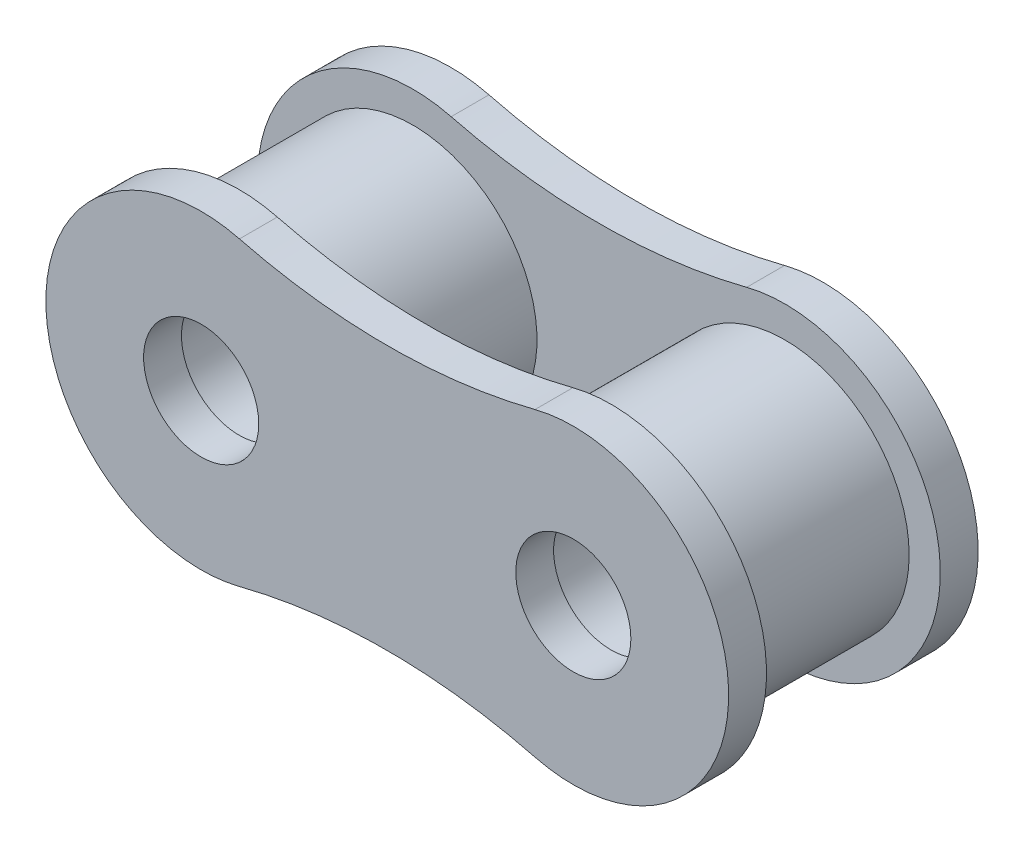
ISO-10303-21;
HEADER;
FILE_DESCRIPTION(('STEP AP214'),'2;1');
FILE_NAME('part.step','',(''),(''),'','','');
FILE_SCHEMA(('AUTOMOTIVE_DESIGN { 1 0 10303 214 1 1 1 1 }'));
ENDSEC;
DATA;
#1=APPLICATION_CONTEXT('core data for automotive mechanical design processes');
#2=APPLICATION_PROTOCOL_DEFINITION('international standard','automotive_design',2000,#1);
#3=PRODUCT_CONTEXT('',#1,'mechanical');
#4=PRODUCT('Part','Part','',(#3));
#5=PRODUCT_RELATED_PRODUCT_CATEGORY('part','',(#4));
#6=PRODUCT_DEFINITION_FORMATION('','',#4);
#7=PRODUCT_DEFINITION_CONTEXT('part definition',#1,'design');
#8=PRODUCT_DEFINITION('design','',#6,#7);
#9=PRODUCT_DEFINITION_SHAPE('','',#8);
#10=(LENGTH_UNIT() NAMED_UNIT(*) SI_UNIT(.MILLI.,.METRE.));
#11=(NAMED_UNIT(*) PLANE_ANGLE_UNIT() SI_UNIT($,.RADIAN.));
#12=(NAMED_UNIT(*) SI_UNIT($,.STERADIAN.) SOLID_ANGLE_UNIT());
#13=UNCERTAINTY_MEASURE_WITH_UNIT(LENGTH_MEASURE(1.E-05),#10,'distance_accuracy_value','');
#14=(GEOMETRIC_REPRESENTATION_CONTEXT(3) GLOBAL_UNCERTAINTY_ASSIGNED_CONTEXT((#13)) GLOBAL_UNIT_ASSIGNED_CONTEXT((#10,
#11,#12)) REPRESENTATION_CONTEXT('',''));
#15=CARTESIAN_POINT('',(0.,0.,0.));
#16=DIRECTION('',(0.,0.,1.));
#17=DIRECTION('',(1.,0.,0.));
#18=AXIS2_PLACEMENT_3D('',#15,#16,#17);
#19=CARTESIAN_POINT('',(-2.9972,0.,1.4));
#20=DIRECTION('',(0.,0.,-1.));
#21=DIRECTION('',(-1.,0.,0.));
#22=AXIS2_PLACEMENT_3D('',#19,#20,#21);
#23=CYLINDRICAL_SURFACE('',#22,2.);
#24=CARTESIAN_POINT('',(-2.9972,0.,1.4));
#25=DIRECTION('',(0.,0.,1.));
#26=DIRECTION('',(1.,0.,0.));
#27=AXIS2_PLACEMENT_3D('',#24,#25,#26);
#28=CIRCLE('',#27,2.);
#29=CARTESIAN_POINT('',(-0.9972,0.,1.4));
#30=VERTEX_POINT('',#29);
#31=EDGE_CURVE('E11',#30,#30,#28,.T.);
#32=ORIENTED_EDGE('',*,*,#31,.F.);
#33=EDGE_LOOP('',(#32));
#34=FACE_BOUND('',#33,.T.);
#35=CARTESIAN_POINT('',(-2.9972,0.,-1.4));
#36=DIRECTION('',(0.,0.,-1.));
#37=DIRECTION('',(-1.,0.,0.));
#38=AXIS2_PLACEMENT_3D('',#35,#36,#37);
#39=CIRCLE('',#38,2.);
#40=CARTESIAN_POINT('',(-4.9972,0.,-1.4));
#41=VERTEX_POINT('',#40);
#42=EDGE_CURVE('E166',#41,#41,#39,.T.);
#43=ORIENTED_EDGE('',*,*,#42,.F.);
#44=EDGE_LOOP('',(#43));
#45=FACE_BOUND('',#44,.T.);
#46=ADVANCED_FACE('F40',(#34,#45),#23,.T.);
#47=CARTESIAN_POINT('',(1.4986,5.89043594120135,1.4));
#48=DIRECTION('',(0.,0.,1.));
#49=DIRECTION('',(1.,0.,0.));
#50=AXIS2_PLACEMENT_3D('',#47,#48,#49);
#51=PLANE('',#50);
#52=CARTESIAN_POINT('',(-2.9972,0.,1.4));
#53=DIRECTION('',(0.,0.,1.));
#54=DIRECTION('',(1.,0.,0.));
#55=AXIS2_PLACEMENT_3D('',#52,#53,#54);
#56=CIRCLE('',#55,0.9271);
#57=CARTESIAN_POINT('',(-2.0701,0.,1.4));
#58=VERTEX_POINT('',#57);
#59=EDGE_CURVE('E180',#58,#58,#56,.T.);
#60=ORIENTED_EDGE('',*,*,#59,.T.);
#61=EDGE_LOOP('',(#60));
#62=FACE_BOUND('',#61,.T.);
#63=CARTESIAN_POINT('',(-2.9972,0.,1.4));
#64=DIRECTION('',(0.,0.,1.));
#65=DIRECTION('',(1.,0.,0.));
#66=AXIS2_PLACEMENT_3D('',#63,#64,#65);
#67=CIRCLE('',#66,0.9525);
#68=CARTESIAN_POINT('',(-2.0447,0.,1.4));
#69=VERTEX_POINT('',#68);
#70=EDGE_CURVE('E210',#69,#69,#67,.T.);
#71=ORIENTED_EDGE('',*,*,#70,.F.);
#72=EDGE_LOOP('',(#71));
#73=FACE_BOUND('',#72,.T.);
#74=ADVANCED_FACE('F229',(#62,#73),#51,.F.);
#75=CARTESIAN_POINT('',(1.4986,5.89043594120135,-1.4));
#76=DIRECTION('',(0.,0.,-1.));
#77=DIRECTION('',(1.,0.,0.));
#78=AXIS2_PLACEMENT_3D('',#75,#76,#77);
#79=PLANE('',#78);
#80=CARTESIAN_POINT('',(-2.9972,0.,-1.4));
#81=DIRECTION('',(0.,0.,1.));
#82=DIRECTION('',(1.,0.,0.));
#83=AXIS2_PLACEMENT_3D('',#80,#81,#82);
#84=CIRCLE('',#83,0.9271);
#85=CARTESIAN_POINT('',(-2.0701,0.,-1.4));
#86=VERTEX_POINT('',#85);
#87=EDGE_CURVE('E147',#86,#86,#84,.T.);
#88=ORIENTED_EDGE('',*,*,#87,.F.);
#89=EDGE_LOOP('',(#88));
#90=FACE_BOUND('',#89,.T.);
#91=CARTESIAN_POINT('',(-2.9972,0.,-1.4));
#92=DIRECTION('',(0.,0.,1.));
#93=DIRECTION('',(1.,0.,0.));
#94=AXIS2_PLACEMENT_3D('',#91,#92,#93);
#95=CIRCLE('',#94,0.9525);
#96=CARTESIAN_POINT('',(-2.0447,0.,-1.4));
#97=VERTEX_POINT('',#96);
#98=EDGE_CURVE('E48',#97,#97,#95,.T.);
#99=ORIENTED_EDGE('',*,*,#98,.T.);
#100=EDGE_LOOP('',(#99));
#101=FACE_BOUND('',#100,.T.);
#102=ADVANCED_FACE('F215',(#90,#101),#79,.F.);
#103=CARTESIAN_POINT('',(2.9972,0.,1.4));
#104=DIRECTION('',(0.,0.,1.));
#105=DIRECTION('',(1.,0.,0.));
#106=AXIS2_PLACEMENT_3D('',#103,#104,#105);
#107=CIRCLE('',#106,0.9271);
#108=CARTESIAN_POINT('',(3.9243,0.,1.4));
#109=VERTEX_POINT('',#108);
#110=EDGE_CURVE('E174',#109,#109,#107,.T.);
#111=ORIENTED_EDGE('',*,*,#110,.T.);
#112=EDGE_LOOP('',(#111));
#113=FACE_BOUND('',#112,.T.);
#114=CARTESIAN_POINT('',(2.9972,0.,1.4));
#115=DIRECTION('',(0.,0.,1.));
#116=DIRECTION('',(1.,0.,0.));
#117=AXIS2_PLACEMENT_3D('',#114,#115,#116);
#118=CIRCLE('',#117,0.9525);
#119=CARTESIAN_POINT('',(3.9497,0.,1.4));
#120=VERTEX_POINT('',#119);
#121=EDGE_CURVE('E163',#120,#120,#118,.T.);
#122=ORIENTED_EDGE('',*,*,#121,.F.);
#123=EDGE_LOOP('',(#122));
#124=FACE_BOUND('',#123,.T.);
#125=ADVANCED_FACE('F236',(#113,#124),#51,.F.);
#126=CARTESIAN_POINT('',(1.4986,5.89043594120135,2.0096));
#127=DIRECTION('',(0.,0.,1.));
#128=DIRECTION('',(1.,0.,0.));
#129=AXIS2_PLACEMENT_3D('',#126,#127,#128);
#130=PLANE('',#129);
#131=CARTESIAN_POINT('',(-2.9972,0.,2.0096));
#132=DIRECTION('',(0.,0.,1.));
#133=DIRECTION('',(1.,0.,0.));
#134=AXIS2_PLACEMENT_3D('',#131,#132,#133);
#135=CIRCLE('',#134,0.9271);
#136=CARTESIAN_POINT('',(-2.0701,0.,2.0096));
#137=VERTEX_POINT('',#136);
#138=EDGE_CURVE('E183',#137,#137,#135,.T.);
#139=ORIENTED_EDGE('',*,*,#138,.F.);
#140=EDGE_LOOP('',(#139));
#141=FACE_BOUND('',#140,.T.);
#142=CARTESIAN_POINT('',(0.,11.7808718824027,2.0096));
#143=DIRECTION('',(0.,0.,-1.));
#144=DIRECTION('',(1.,0.,0.));
#145=AXIS2_PLACEMENT_3D('',#142,#143,#144);
#146=CIRCLE('',#145,9.65425688240271);
#147=CARTESIAN_POINT('',(2.3803360723178,2.42466131752962,2.0096));
#148=VERTEX_POINT('',#147);
#149=CARTESIAN_POINT('',(-2.3803360723178,2.42466131752962,2.0096));
#150=VERTEX_POINT('',#149);
#151=EDGE_CURVE('E189',#148,#150,#146,.T.);
#152=ORIENTED_EDGE('',*,*,#151,.T.);
#153=CARTESIAN_POINT('',(-2.9972,0.,2.0096));
#154=DIRECTION('',(0.,0.,1.));
#155=DIRECTION('',(1.,0.,0.));
#156=AXIS2_PLACEMENT_3D('',#153,#154,#155);
#157=CIRCLE('',#156,2.5019);
#158=CARTESIAN_POINT('',(-2.3803360723178,-2.42466131752962,2.0096));
#159=VERTEX_POINT('',#158);
#160=EDGE_CURVE('E88',#150,#159,#157,.T.);
#161=ORIENTED_EDGE('',*,*,#160,.T.);
#162=CARTESIAN_POINT('',(0.,-11.7808718824027,2.0096));
#163=DIRECTION('',(0.,0.,-1.));
#164=DIRECTION('',(1.,0.,0.));
#165=AXIS2_PLACEMENT_3D('',#162,#163,#164);
#166=CIRCLE('',#165,9.6542568824027);
#167=CARTESIAN_POINT('',(2.3803360723178,-2.42466131752962,2.0096));
#168=VERTEX_POINT('',#167);
#169=EDGE_CURVE('E192',#159,#168,#166,.T.);
#170=ORIENTED_EDGE('',*,*,#169,.T.);
#171=CARTESIAN_POINT('',(2.9972,0.,2.0096));
#172=DIRECTION('',(0.,0.,1.));
#173=DIRECTION('',(1.,0.,0.));
#174=AXIS2_PLACEMENT_3D('',#171,#172,#173);
#175=CIRCLE('',#174,2.5019);
#176=EDGE_CURVE('E56',#168,#148,#175,.T.);
#177=ORIENTED_EDGE('',*,*,#176,.T.);
#178=EDGE_LOOP('',(#152,#161,#170,#177));
#179=FACE_BOUND('',#178,.T.);
#180=CARTESIAN_POINT('',(2.9972,0.,2.0096));
#181=DIRECTION('',(0.,0.,1.));
#182=DIRECTION('',(1.,0.,0.));
#183=AXIS2_PLACEMENT_3D('',#180,#181,#182);
#184=CIRCLE('',#183,0.9271);
#185=CARTESIAN_POINT('',(3.9243,0.,2.0096));
#186=VERTEX_POINT('',#185);
#187=EDGE_CURVE('E177',#186,#186,#184,.T.);
#188=ORIENTED_EDGE('',*,*,#187,.F.);
#189=EDGE_LOOP('',(#188));
#190=FACE_BOUND('',#189,.T.);
#191=ADVANCED_FACE('F283',(#141,#179,#190),#130,.T.);
#192=ORIENTED_EDGE('',*,*,#31,.T.);
#193=EDGE_LOOP('',(#192));
#194=FACE_BOUND('',#193,.T.);
#195=CARTESIAN_POINT('',(2.9972,0.,1.4));
#196=DIRECTION('',(0.,0.,1.));
#197=DIRECTION('',(1.,0.,0.));
#198=AXIS2_PLACEMENT_3D('',#195,#196,#197);
#199=CIRCLE('',#198,2.);
#200=CARTESIAN_POINT('',(4.9972,0.,1.4));
#201=VERTEX_POINT('',#200);
#202=EDGE_CURVE('E171',#201,#201,#199,.T.);
#203=ORIENTED_EDGE('',*,*,#202,.T.);
#204=EDGE_LOOP('',(#203));
#205=FACE_BOUND('',#204,.T.);
#206=CARTESIAN_POINT('',(0.,11.7808718824027,1.4));
#207=DIRECTION('',(0.,0.,-1.));
#208=DIRECTION('',(1.,0.,0.));
#209=AXIS2_PLACEMENT_3D('',#206,#207,#208);
#210=CIRCLE('',#209,9.65425688240271);
#211=CARTESIAN_POINT('',(2.3803360723178,2.42466131752962,1.4));
#212=VERTEX_POINT('',#211);
#213=CARTESIAN_POINT('',(-2.3803360723178,2.42466131752962,1.4));
#214=VERTEX_POINT('',#213);
#215=EDGE_CURVE('E186',#212,#214,#210,.T.);
#216=ORIENTED_EDGE('',*,*,#215,.F.);
#217=CARTESIAN_POINT('',(2.9972,0.,1.4));
#218=DIRECTION('',(0.,0.,1.));
#219=DIRECTION('',(1.,0.,0.));
#220=AXIS2_PLACEMENT_3D('',#217,#218,#219);
#221=CIRCLE('',#220,2.5019);
#222=CARTESIAN_POINT('',(2.3803360723178,-2.42466131752962,1.4));
#223=VERTEX_POINT('',#222);
#224=EDGE_CURVE('E80',#223,#212,#221,.T.);
#225=ORIENTED_EDGE('',*,*,#224,.F.);
#226=CARTESIAN_POINT('',(0.,-11.7808718824027,1.4));
#227=DIRECTION('',(0.,0.,-1.));
#228=DIRECTION('',(1.,0.,0.));
#229=AXIS2_PLACEMENT_3D('',#226,#227,#228);
#230=CIRCLE('',#229,9.6542568824027);
#231=CARTESIAN_POINT('',(-2.3803360723178,-2.42466131752962,1.4));
#232=VERTEX_POINT('',#231);
#233=EDGE_CURVE('E74',#232,#223,#230,.T.);
#234=ORIENTED_EDGE('',*,*,#233,.F.);
#235=CARTESIAN_POINT('',(-2.9972,0.,1.4));
#236=DIRECTION('',(0.,0.,1.));
#237=DIRECTION('',(1.,0.,0.));
#238=AXIS2_PLACEMENT_3D('',#235,#236,#237);
#239=CIRCLE('',#238,2.5019);
#240=EDGE_CURVE('E198',#214,#232,#239,.T.);
#241=ORIENTED_EDGE('',*,*,#240,.F.);
#242=EDGE_LOOP('',(#216,#225,#234,#241));
#243=FACE_BOUND('',#242,.T.);
#244=ADVANCED_FACE('F237',(#194,#205,#243),#51,.F.);
#245=CARTESIAN_POINT('',(0.,11.7808718824027,2.0096));
#246=DIRECTION('',(0.,0.,-1.));
#247=DIRECTION('',(-1.,0.,0.));
#248=AXIS2_PLACEMENT_3D('',#245,#246,#247);
#249=CYLINDRICAL_SURFACE('',#248,9.65425688240271);
#250=ORIENTED_EDGE('',*,*,#215,.T.);
#251=DIRECTION('',(0.,0.,-1.));
#252=VECTOR('',#251,1.);
#253=CARTESIAN_POINT('',(-2.3803360723178,2.42466131752962,2.0096));
#254=LINE('',#253,#252);
#255=EDGE_CURVE('E167',#150,#214,#254,.T.);
#256=ORIENTED_EDGE('',*,*,#255,.F.);
#257=ORIENTED_EDGE('',*,*,#151,.F.);
#258=DIRECTION('',(0.,0.,-1.));
#259=VECTOR('',#258,1.);
#260=CARTESIAN_POINT('',(2.3803360723178,2.42466131752962,2.0096));
#261=LINE('',#260,#259);
#262=EDGE_CURVE('E195',#148,#212,#261,.T.);
#263=ORIENTED_EDGE('',*,*,#262,.T.);
#264=EDGE_LOOP('',(#250,#256,#257,#263));
#265=FACE_BOUND('',#264,.T.);
#266=ADVANCED_FACE('F288',(#265),#249,.F.);
#267=CARTESIAN_POINT('',(-2.9972,0.,2.0096));
#268=DIRECTION('',(0.,0.,-1.));
#269=DIRECTION('',(-1.,0.,0.));
#270=AXIS2_PLACEMENT_3D('',#267,#268,#269);
#271=CYLINDRICAL_SURFACE('',#270,2.5019);
#272=ORIENTED_EDGE('',*,*,#240,.T.);
#273=DIRECTION('',(0.,0.,-1.));
#274=VECTOR('',#273,1.);
#275=CARTESIAN_POINT('',(-2.3803360723178,-2.42466131752962,2.0096));
#276=LINE('',#275,#274);
#277=EDGE_CURVE('E205',#159,#232,#276,.T.);
#278=ORIENTED_EDGE('',*,*,#277,.F.);
#279=ORIENTED_EDGE('',*,*,#160,.F.);
#280=ORIENTED_EDGE('',*,*,#255,.T.);
#281=EDGE_LOOP('',(#272,#278,#279,#280));
#282=FACE_BOUND('',#281,.T.);
#283=ADVANCED_FACE('F295',(#282),#271,.T.);
#284=CARTESIAN_POINT('',(0.,-11.7808718824027,2.0096));
#285=DIRECTION('',(0.,0.,-1.));
#286=DIRECTION('',(-1.,0.,0.));
#287=AXIS2_PLACEMENT_3D('',#284,#285,#286);
#288=CYLINDRICAL_SURFACE('',#287,9.6542568824027);
#289=ORIENTED_EDGE('',*,*,#233,.T.);
#290=DIRECTION('',(0.,0.,-1.));
#291=VECTOR('',#290,1.);
#292=CARTESIAN_POINT('',(2.3803360723178,-2.42466131752962,2.0096));
#293=LINE('',#292,#291);
#294=EDGE_CURVE('E203',#168,#223,#293,.T.);
#295=ORIENTED_EDGE('',*,*,#294,.F.);
#296=ORIENTED_EDGE('',*,*,#169,.F.);
#297=ORIENTED_EDGE('',*,*,#277,.T.);
#298=EDGE_LOOP('',(#289,#295,#296,#297));
#299=FACE_BOUND('',#298,.T.);
#300=ADVANCED_FACE('F292',(#299),#288,.F.);
#301=CARTESIAN_POINT('',(2.9972,0.,2.0096));
#302=DIRECTION('',(0.,0.,-1.));
#303=DIRECTION('',(-1.,0.,0.));
#304=AXIS2_PLACEMENT_3D('',#301,#302,#303);
#305=CYLINDRICAL_SURFACE('',#304,2.5019);
#306=ORIENTED_EDGE('',*,*,#224,.T.);
#307=ORIENTED_EDGE('',*,*,#262,.F.);
#308=ORIENTED_EDGE('',*,*,#176,.F.);
#309=ORIENTED_EDGE('',*,*,#294,.T.);
#310=EDGE_LOOP('',(#306,#307,#308,#309));
#311=FACE_BOUND('',#310,.T.);
#312=ADVANCED_FACE('F281',(#311),#305,.T.);
#313=CARTESIAN_POINT('',(-2.9972,0.,2.0096));
#314=DIRECTION('',(0.,0.,-1.));
#315=DIRECTION('',(-1.,0.,0.));
#316=AXIS2_PLACEMENT_3D('',#313,#314,#315);
#317=CYLINDRICAL_SURFACE('',#316,0.9271);
#318=ORIENTED_EDGE('',*,*,#138,.T.);
#319=EDGE_LOOP('',(#318));
#320=FACE_BOUND('',#319,.T.);
#321=ORIENTED_EDGE('',*,*,#59,.F.);
#322=EDGE_LOOP('',(#321));
#323=FACE_BOUND('',#322,.T.);
#324=ADVANCED_FACE('F277',(#320,#323),#317,.F.);
#325=CARTESIAN_POINT('',(2.9972,0.,2.0096));
#326=DIRECTION('',(0.,0.,-1.));
#327=DIRECTION('',(-1.,0.,0.));
#328=AXIS2_PLACEMENT_3D('',#325,#326,#327);
#329=CYLINDRICAL_SURFACE('',#328,0.9271);
#330=ORIENTED_EDGE('',*,*,#187,.T.);
#331=EDGE_LOOP('',(#330));
#332=FACE_BOUND('',#331,.T.);
#333=ORIENTED_EDGE('',*,*,#110,.F.);
#334=EDGE_LOOP('',(#333));
#335=FACE_BOUND('',#334,.T.);
#336=ADVANCED_FACE('F273',(#332,#335),#329,.F.);
#337=CARTESIAN_POINT('',(2.9972,0.,1.4));
#338=DIRECTION('',(0.,0.,-1.));
#339=DIRECTION('',(-1.,0.,0.));
#340=AXIS2_PLACEMENT_3D('',#337,#338,#339);
#341=CYLINDRICAL_SURFACE('',#340,2.);
#342=ORIENTED_EDGE('',*,*,#202,.F.);
#343=EDGE_LOOP('',(#342));
#344=FACE_BOUND('',#343,.T.);
#345=CARTESIAN_POINT('',(2.9972,0.,-1.4));
#346=DIRECTION('',(0.,0.,1.));
#347=DIRECTION('',(1.,0.,0.));
#348=AXIS2_PLACEMENT_3D('',#345,#346,#347);
#349=CIRCLE('',#348,2.);
#350=CARTESIAN_POINT('',(4.9972,0.,-1.4));
#351=VERTEX_POINT('',#350);
#352=EDGE_CURVE('E126',#351,#351,#349,.T.);
#353=ORIENTED_EDGE('',*,*,#352,.T.);
#354=EDGE_LOOP('',(#353));
#355=FACE_BOUND('',#354,.T.);
#356=ADVANCED_FACE('F269',(#344,#355),#341,.T.);
#357=CARTESIAN_POINT('',(2.9972,0.,1.4));
#358=DIRECTION('',(0.,0.,-1.));
#359=DIRECTION('',(-1.,0.,0.));
#360=AXIS2_PLACEMENT_3D('',#357,#358,#359);
#361=CYLINDRICAL_SURFACE('',#360,0.9525);
#362=ORIENTED_EDGE('',*,*,#121,.T.);
#363=EDGE_LOOP('',(#362));
#364=FACE_BOUND('',#363,.T.);
#365=CARTESIAN_POINT('',(2.9972,0.,-1.4));
#366=DIRECTION('',(0.,0.,1.));
#367=DIRECTION('',(1.,0.,0.));
#368=AXIS2_PLACEMENT_3D('',#365,#366,#367);
#369=CIRCLE('',#368,0.9525);
#370=CARTESIAN_POINT('',(3.9497,0.,-1.4));
#371=VERTEX_POINT('',#370);
#372=EDGE_CURVE('E168',#371,#371,#369,.T.);
#373=ORIENTED_EDGE('',*,*,#372,.F.);
#374=EDGE_LOOP('',(#373));
#375=FACE_BOUND('',#374,.T.);
#376=ADVANCED_FACE('F266',(#364,#375),#361,.F.);
#377=CARTESIAN_POINT('',(2.9972,0.,-1.4));
#378=DIRECTION('',(0.,0.,1.));
#379=DIRECTION('',(1.,0.,0.));
#380=AXIS2_PLACEMENT_3D('',#377,#378,#379);
#381=CIRCLE('',#380,0.9271);
#382=CARTESIAN_POINT('',(3.9243,0.,-1.4));
#383=VERTEX_POINT('',#382);
#384=EDGE_CURVE('E335',#383,#383,#381,.T.);
#385=ORIENTED_EDGE('',*,*,#384,.F.);
#386=EDGE_LOOP('',(#385));
#387=FACE_BOUND('',#386,.T.);
#388=ORIENTED_EDGE('',*,*,#372,.T.);
#389=EDGE_LOOP('',(#388));
#390=FACE_BOUND('',#389,.T.);
#391=ADVANCED_FACE('F246',(#387,#390),#79,.F.);
#392=CARTESIAN_POINT('',(1.4986,5.89043594120135,-2.0096));
#393=DIRECTION('',(0.,0.,-1.));
#394=DIRECTION('',(1.,0.,0.));
#395=AXIS2_PLACEMENT_3D('',#392,#393,#394);
#396=PLANE('',#395);
#397=CARTESIAN_POINT('',(-2.9972,0.,-2.0096));
#398=DIRECTION('',(0.,0.,1.));
#399=DIRECTION('',(1.,0.,0.));
#400=AXIS2_PLACEMENT_3D('',#397,#398,#399);
#401=CIRCLE('',#400,0.9271);
#402=CARTESIAN_POINT('',(-2.0701,0.,-2.0096));
#403=VERTEX_POINT('',#402);
#404=EDGE_CURVE('E155',#403,#403,#401,.T.);
#405=ORIENTED_EDGE('',*,*,#404,.T.);
#406=EDGE_LOOP('',(#405));
#407=FACE_BOUND('',#406,.T.);
#408=CARTESIAN_POINT('',(0.,11.7808718824027,-2.0096));
#409=DIRECTION('',(0.,0.,-1.));
#410=DIRECTION('',(1.,0.,0.));
#411=AXIS2_PLACEMENT_3D('',#408,#409,#410);
#412=CIRCLE('',#411,9.65425688240271);
#413=CARTESIAN_POINT('',(2.3803360723178,2.42466131752962,-2.0096));
#414=VERTEX_POINT('',#413);
#415=CARTESIAN_POINT('',(-2.3803360723178,2.42466131752962,-2.0096));
#416=VERTEX_POINT('',#415);
#417=EDGE_CURVE('E134',#414,#416,#412,.T.);
#418=ORIENTED_EDGE('',*,*,#417,.F.);
#419=CARTESIAN_POINT('',(2.9972,0.,-2.0096));
#420=DIRECTION('',(0.,0.,1.));
#421=DIRECTION('',(1.,0.,0.));
#422=AXIS2_PLACEMENT_3D('',#419,#420,#421);
#423=CIRCLE('',#422,2.5019);
#424=CARTESIAN_POINT('',(2.3803360723178,-2.42466131752962,-2.0096));
#425=VERTEX_POINT('',#424);
#426=EDGE_CURVE('E151',#425,#414,#423,.T.);
#427=ORIENTED_EDGE('',*,*,#426,.F.);
#428=CARTESIAN_POINT('',(0.,-11.7808718824027,-2.0096));
#429=DIRECTION('',(0.,0.,-1.));
#430=DIRECTION('',(1.,0.,0.));
#431=AXIS2_PLACEMENT_3D('',#428,#429,#430);
#432=CIRCLE('',#431,9.6542568824027);
#433=CARTESIAN_POINT('',(-2.3803360723178,-2.42466131752962,-2.0096));
#434=VERTEX_POINT('',#433);
#435=EDGE_CURVE('E136',#434,#425,#432,.T.);
#436=ORIENTED_EDGE('',*,*,#435,.F.);
#437=CARTESIAN_POINT('',(-2.9972,0.,-2.0096));
#438=DIRECTION('',(0.,0.,1.));
#439=DIRECTION('',(1.,0.,0.));
#440=AXIS2_PLACEMENT_3D('',#437,#438,#439);
#441=CIRCLE('',#440,2.5019);
#442=EDGE_CURVE('E118',#416,#434,#441,.T.);
#443=ORIENTED_EDGE('',*,*,#442,.F.);
#444=EDGE_LOOP('',(#418,#427,#436,#443));
#445=FACE_BOUND('',#444,.T.);
#446=CARTESIAN_POINT('',(2.9972,0.,-2.0096));
#447=DIRECTION('',(0.,0.,1.));
#448=DIRECTION('',(1.,0.,0.));
#449=AXIS2_PLACEMENT_3D('',#446,#447,#448);
#450=CIRCLE('',#449,0.9271);
#451=CARTESIAN_POINT('',(3.9243,0.,-2.0096));
#452=VERTEX_POINT('',#451);
#453=EDGE_CURVE('E332',#452,#452,#450,.T.);
#454=ORIENTED_EDGE('',*,*,#453,.T.);
#455=EDGE_LOOP('',(#454));
#456=FACE_BOUND('',#455,.T.);
#457=ADVANCED_FACE('F131',(#407,#445,#456),#396,.T.);
#458=ORIENTED_EDGE('',*,*,#42,.T.);
#459=EDGE_LOOP('',(#458));
#460=FACE_BOUND('',#459,.T.);
#461=ORIENTED_EDGE('',*,*,#352,.F.);
#462=EDGE_LOOP('',(#461));
#463=FACE_BOUND('',#462,.T.);
#464=CARTESIAN_POINT('',(0.,11.7808718824027,-1.4));
#465=DIRECTION('',(0.,0.,-1.));
#466=DIRECTION('',(1.,0.,0.));
#467=AXIS2_PLACEMENT_3D('',#464,#465,#466);
#468=CIRCLE('',#467,9.65425688240271);
#469=CARTESIAN_POINT('',(2.3803360723178,2.42466131752962,-1.4));
#470=VERTEX_POINT('',#469);
#471=CARTESIAN_POINT('',(-2.3803360723178,2.42466131752962,-1.4));
#472=VERTEX_POINT('',#471);
#473=EDGE_CURVE('E153',#470,#472,#468,.T.);
#474=ORIENTED_EDGE('',*,*,#473,.T.);
#475=CARTESIAN_POINT('',(-2.9972,0.,-1.4));
#476=DIRECTION('',(0.,0.,1.));
#477=DIRECTION('',(1.,0.,0.));
#478=AXIS2_PLACEMENT_3D('',#475,#476,#477);
#479=CIRCLE('',#478,2.5019);
#480=CARTESIAN_POINT('',(-2.3803360723178,-2.42466131752962,-1.4));
#481=VERTEX_POINT('',#480);
#482=EDGE_CURVE('E121',#472,#481,#479,.T.);
#483=ORIENTED_EDGE('',*,*,#482,.T.);
#484=CARTESIAN_POINT('',(0.,-11.7808718824027,-1.4));
#485=DIRECTION('',(0.,0.,-1.));
#486=DIRECTION('',(1.,0.,0.));
#487=AXIS2_PLACEMENT_3D('',#484,#485,#486);
#488=CIRCLE('',#487,9.6542568824027);
#489=CARTESIAN_POINT('',(2.3803360723178,-2.42466131752962,-1.4));
#490=VERTEX_POINT('',#489);
#491=EDGE_CURVE('E144',#481,#490,#488,.T.);
#492=ORIENTED_EDGE('',*,*,#491,.T.);
#493=CARTESIAN_POINT('',(2.9972,0.,-1.4));
#494=DIRECTION('',(0.,0.,1.));
#495=DIRECTION('',(1.,0.,0.));
#496=AXIS2_PLACEMENT_3D('',#493,#494,#495);
#497=CIRCLE('',#496,2.5019);
#498=EDGE_CURVE('E141',#490,#470,#497,.T.);
#499=ORIENTED_EDGE('',*,*,#498,.T.);
#500=EDGE_LOOP('',(#474,#483,#492,#499));
#501=FACE_BOUND('',#500,.T.);
#502=ADVANCED_FACE('F242',(#460,#463,#501),#79,.F.);
#503=CARTESIAN_POINT('',(0.,11.7808718824027,-2.0096));
#504=DIRECTION('',(0.,0.,1.));
#505=DIRECTION('',(-1.,0.,0.));
#506=AXIS2_PLACEMENT_3D('',#503,#504,#505);
#507=CYLINDRICAL_SURFACE('',#506,9.65425688240271);
#508=ORIENTED_EDGE('',*,*,#473,.F.);
#509=DIRECTION('',(0.,0.,1.));
#510=VECTOR('',#509,1.);
#511=CARTESIAN_POINT('',(2.3803360723178,2.42466131752962,-2.0096));
#512=LINE('',#511,#510);
#513=EDGE_CURVE('E139',#414,#470,#512,.T.);
#514=ORIENTED_EDGE('',*,*,#513,.F.);
#515=ORIENTED_EDGE('',*,*,#417,.T.);
#516=DIRECTION('',(0.,0.,1.));
#517=VECTOR('',#516,1.);
#518=CARTESIAN_POINT('',(-2.3803360723178,2.42466131752962,-2.0096));
#519=LINE('',#518,#517);
#520=EDGE_CURVE('E115',#416,#472,#519,.T.);
#521=ORIENTED_EDGE('',*,*,#520,.T.);
#522=EDGE_LOOP('',(#508,#514,#515,#521));
#523=FACE_BOUND('',#522,.T.);
#524=ADVANCED_FACE('F138',(#523),#507,.F.);
#525=CARTESIAN_POINT('',(-2.9972,0.,-2.0096));
#526=DIRECTION('',(0.,0.,1.));
#527=DIRECTION('',(-1.,0.,0.));
#528=AXIS2_PLACEMENT_3D('',#525,#526,#527);
#529=CYLINDRICAL_SURFACE('',#528,2.5019);
#530=ORIENTED_EDGE('',*,*,#482,.F.);
#531=ORIENTED_EDGE('',*,*,#520,.F.);
#532=ORIENTED_EDGE('',*,*,#442,.T.);
#533=DIRECTION('',(0.,0.,1.));
#534=VECTOR('',#533,1.);
#535=CARTESIAN_POINT('',(-2.3803360723178,-2.42466131752962,-2.0096));
#536=LINE('',#535,#534);
#537=EDGE_CURVE('E127',#434,#481,#536,.T.);
#538=ORIENTED_EDGE('',*,*,#537,.T.);
#539=EDGE_LOOP('',(#530,#531,#532,#538));
#540=FACE_BOUND('',#539,.T.);
#541=ADVANCED_FACE('F117',(#540),#529,.T.);
#542=CARTESIAN_POINT('',(0.,-11.7808718824027,-2.0096));
#543=DIRECTION('',(0.,0.,1.));
#544=DIRECTION('',(-1.,0.,0.));
#545=AXIS2_PLACEMENT_3D('',#542,#543,#544);
#546=CYLINDRICAL_SURFACE('',#545,9.6542568824027);
#547=ORIENTED_EDGE('',*,*,#491,.F.);
#548=ORIENTED_EDGE('',*,*,#537,.F.);
#549=ORIENTED_EDGE('',*,*,#435,.T.);
#550=DIRECTION('',(0.,0.,1.));
#551=VECTOR('',#550,1.);
#552=CARTESIAN_POINT('',(2.3803360723178,-2.42466131752962,-2.0096));
#553=LINE('',#552,#551);
#554=EDGE_CURVE('E160',#425,#490,#553,.T.);
#555=ORIENTED_EDGE('',*,*,#554,.T.);
#556=EDGE_LOOP('',(#547,#548,#549,#555));
#557=FACE_BOUND('',#556,.T.);
#558=ADVANCED_FACE('F254',(#557),#546,.F.);
#559=CARTESIAN_POINT('',(2.9972,0.,-2.0096));
#560=DIRECTION('',(0.,0.,1.));
#561=DIRECTION('',(-1.,0.,0.));
#562=AXIS2_PLACEMENT_3D('',#559,#560,#561);
#563=CYLINDRICAL_SURFACE('',#562,2.5019);
#564=ORIENTED_EDGE('',*,*,#498,.F.);
#565=ORIENTED_EDGE('',*,*,#554,.F.);
#566=ORIENTED_EDGE('',*,*,#426,.T.);
#567=ORIENTED_EDGE('',*,*,#513,.T.);
#568=EDGE_LOOP('',(#564,#565,#566,#567));
#569=FACE_BOUND('',#568,.T.);
#570=ADVANCED_FACE('F252',(#569),#563,.T.);
#571=CARTESIAN_POINT('',(-2.9972,0.,-2.0096));
#572=DIRECTION('',(0.,0.,1.));
#573=DIRECTION('',(-1.,0.,0.));
#574=AXIS2_PLACEMENT_3D('',#571,#572,#573);
#575=CYLINDRICAL_SURFACE('',#574,0.9271);
#576=ORIENTED_EDGE('',*,*,#404,.F.);
#577=EDGE_LOOP('',(#576));
#578=FACE_BOUND('',#577,.T.);
#579=ORIENTED_EDGE('',*,*,#87,.T.);
#580=EDGE_LOOP('',(#579));
#581=FACE_BOUND('',#580,.T.);
#582=ADVANCED_FACE('F224',(#578,#581),#575,.F.);
#583=CARTESIAN_POINT('',(2.9972,0.,-2.0096));
#584=DIRECTION('',(0.,0.,1.));
#585=DIRECTION('',(-1.,0.,0.));
#586=AXIS2_PLACEMENT_3D('',#583,#584,#585);
#587=CYLINDRICAL_SURFACE('',#586,0.9271);
#588=ORIENTED_EDGE('',*,*,#453,.F.);
#589=EDGE_LOOP('',(#588));
#590=FACE_BOUND('',#589,.T.);
#591=ORIENTED_EDGE('',*,*,#384,.T.);
#592=EDGE_LOOP('',(#591));
#593=FACE_BOUND('',#592,.T.);
#594=ADVANCED_FACE('F219',(#590,#593),#587,.F.);
#595=CARTESIAN_POINT('',(-2.9972,0.,1.4));
#596=DIRECTION('',(0.,0.,-1.));
#597=DIRECTION('',(-1.,0.,0.));
#598=AXIS2_PLACEMENT_3D('',#595,#596,#597);
#599=CYLINDRICAL_SURFACE('',#598,0.9525);
#600=ORIENTED_EDGE('',*,*,#70,.T.);
#601=EDGE_LOOP('',(#600));
#602=FACE_BOUND('',#601,.T.);
#603=ORIENTED_EDGE('',*,*,#98,.F.);
#604=EDGE_LOOP('',(#603));
#605=FACE_BOUND('',#604,.T.);
#606=ADVANCED_FACE('F217',(#602,#605),#599,.F.);
#607=CLOSED_SHELL('',(#46,#74,#102,#125,#191,#244,#266,#283,#300,#312,#324,#336,#356,#376,#391,
#457,#502,#524,#541,#558,#570,#582,#594,#606));
#608=MANIFOLD_SOLID_BREP('B2',#607);
#609=ADVANCED_BREP_SHAPE_REPRESENTATION('',(#18,#608),#14);
#610=SHAPE_DEFINITION_REPRESENTATION(#9,#609);
ENDSEC;
END-ISO-10303-21;
